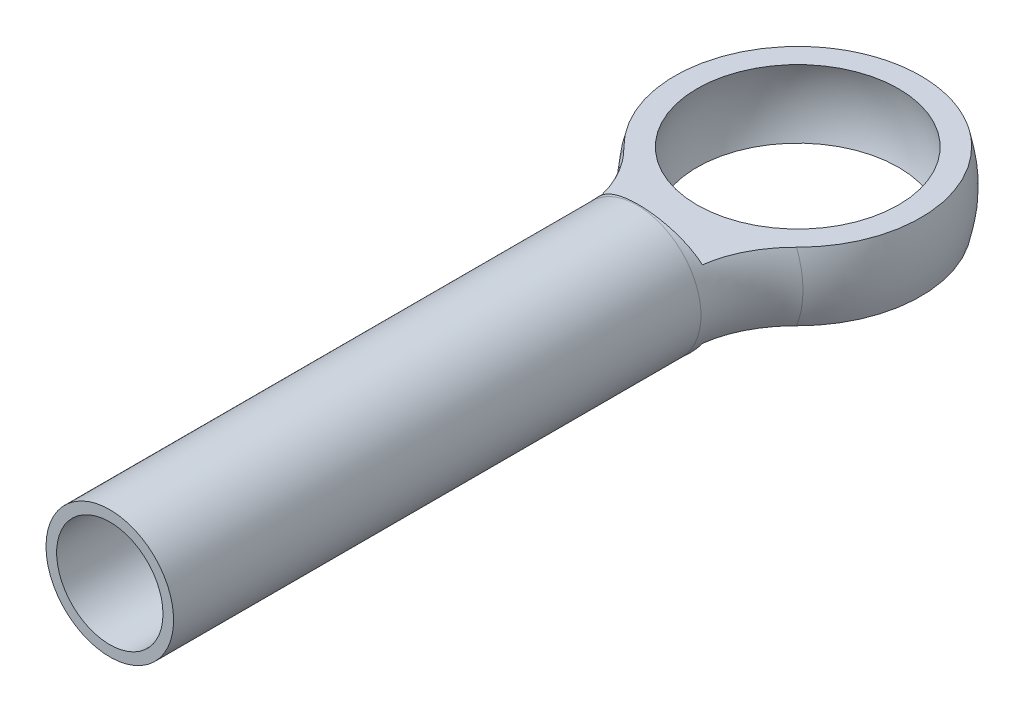
ISO-10303-21;
HEADER;
FILE_DESCRIPTION(('STEP AP214'),'2;1');
FILE_NAME('part.step','',(''),(''),'','','');
FILE_SCHEMA(('AUTOMOTIVE_DESIGN { 1 0 10303 214 1 1 1 1 }'));
ENDSEC;
DATA;
#1=APPLICATION_CONTEXT('core data for automotive mechanical design processes');
#2=APPLICATION_PROTOCOL_DEFINITION('international standard','automotive_design',2000,#1);
#3=PRODUCT_CONTEXT('',#1,'mechanical');
#4=PRODUCT('Part','Part','',(#3));
#5=PRODUCT_RELATED_PRODUCT_CATEGORY('part','',(#4));
#6=PRODUCT_DEFINITION_FORMATION('','',#4);
#7=PRODUCT_DEFINITION_CONTEXT('part definition',#1,'design');
#8=PRODUCT_DEFINITION('design','',#6,#7);
#9=PRODUCT_DEFINITION_SHAPE('','',#8);
#10=(LENGTH_UNIT() NAMED_UNIT(*) SI_UNIT(.MILLI.,.METRE.));
#11=(NAMED_UNIT(*) PLANE_ANGLE_UNIT() SI_UNIT($,.RADIAN.));
#12=(NAMED_UNIT(*) SI_UNIT($,.STERADIAN.) SOLID_ANGLE_UNIT());
#13=UNCERTAINTY_MEASURE_WITH_UNIT(LENGTH_MEASURE(1.E-05),#10,'distance_accuracy_value','');
#14=(GEOMETRIC_REPRESENTATION_CONTEXT(3) GLOBAL_UNCERTAINTY_ASSIGNED_CONTEXT((#13)) GLOBAL_UNIT_ASSIGNED_CONTEXT((#10,
#11,#12)) REPRESENTATION_CONTEXT('',''));
#15=CARTESIAN_POINT('',(0.,0.,0.));
#16=DIRECTION('',(0.,0.,1.));
#17=DIRECTION('',(1.,0.,0.));
#18=AXIS2_PLACEMENT_3D('',#15,#16,#17);
#19=CARTESIAN_POINT('',(0.,0.,4.79414486639693));
#20=DIRECTION('',(0.,0.,-1.));
#21=DIRECTION('',(-1.,0.,0.));
#22=AXIS2_PLACEMENT_3D('',#19,#20,#21);
#23=TOROIDAL_SURFACE('',#22,5.08,3.175);
#24=CARTESIAN_POINT('',(0.,0.,4.79414486639693));
#25=DIRECTION('',(0.,0.,-1.));
#26=DIRECTION('',(-1.,0.,0.));
#27=AXIS2_PLACEMENT_3D('',#24,#25,#26);
#28=CIRCLE('',#27,1.905);
#29=CARTESIAN_POINT('',(-1.905,0.,4.79414486639693));
#30=VERTEX_POINT('',#29);
#31=EDGE_CURVE('E167',#30,#30,#28,.T.);
#32=ORIENTED_EDGE('',*,*,#31,.T.);
#33=EDGE_LOOP('',(#32));
#34=FACE_BOUND('',#33,.T.);
#35=CARTESIAN_POINT('',(0.,0.,2.61498810894378));
#36=DIRECTION('',(0.,0.,-1.));
#37=DIRECTION('',(-1.,0.,0.));
#38=AXIS2_PLACEMENT_3D('',#35,#36,#37);
#39=CIRCLE('',#38,2.77090909090909);
#40=CARTESIAN_POINT('',(-2.57792187431711,-1.016,2.61498810894378));
#41=VERTEX_POINT('',#40);
#42=CARTESIAN_POINT('',(-2.57792187431711,1.016,2.61498810894378));
#43=VERTEX_POINT('',#42);
#44=EDGE_CURVE('E112',#41,#43,#39,.T.);
#45=ORIENTED_EDGE('',*,*,#44,.F.);
#46=CARTESIAN_POINT('',(-2.11639406325257,-1.016,3.17711222518834));
#47=CARTESIAN_POINT('',(-2.01819716090534,-1.016,3.32668512273117));
#48=CARTESIAN_POINT('',(-1.93188686392438,-1.016,3.48417566693142));
#49=CARTESIAN_POINT('',(-1.78741547256896,-1.016,3.81181443928026));
#50=CARTESIAN_POINT('',(-1.72924928215958,-1.016,3.98196036948447));
#51=CARTESIAN_POINT('',(-1.66707849415592,-1.016,4.24143794402896));
#52=CARTESIAN_POINT('',(-1.65057154766357,-1.016,4.3278934820574));
#53=CARTESIAN_POINT('',(-1.62593046187099,-1.016,4.50201596606918));
#54=CARTESIAN_POINT('',(-1.6177960518731,-1.016,4.58968287279413));
#55=CARTESIAN_POINT('',(-1.61016898722803,-1.016,4.76532270648893));
#56=CARTESIAN_POINT('',(-1.61066936125318,-1.016,4.85329532926592));
#57=CARTESIAN_POINT('',(-1.62026287922338,-1.016,5.02874372374261));
#58=CARTESIAN_POINT('',(-1.62935543807155,-1.016,5.11621952886576));
#59=CARTESIAN_POINT('',(-1.66573097291168,-1.016,5.35428529015057));
#60=CARTESIAN_POINT('',(-1.70149811771134,-1.016,5.50364503883666));
#61=CARTESIAN_POINT('',(-1.79568570338797,-1.016,5.79496150703005));
#62=CARTESIAN_POINT('',(-1.85412212587819,-1.016,5.93691292345928));
#63=CARTESIAN_POINT('',(-1.99615149145866,-1.016,6.22199612861055));
#64=CARTESIAN_POINT('',(-2.08138794932638,-1.016,6.3643070437128));
#65=CARTESIAN_POINT('',(-2.271621500792,-1.016,6.63499174081512));
#66=CARTESIAN_POINT('',(-2.3766241082396,-1.016,6.76336161811022));
#67=CARTESIAN_POINT('',(-2.62006966669461,-1.016,7.02122145850842));
#68=CARTESIAN_POINT('',(-2.76114843681511,-1.016,7.14823549674076));
#69=CARTESIAN_POINT('',(-3.06196174697499,-1.016,7.37788491782393));
#70=CARTESIAN_POINT('',(-3.22170200204164,-1.016,7.48051280313634));
#71=CARTESIAN_POINT('',(-3.56229345852077,-1.016,7.66179465288261));
#72=CARTESIAN_POINT('',(-3.7437217643592,-1.016,7.73936948189852));
#73=CARTESIAN_POINT('',(-4.11724555414776,-1.016,7.86209281213687));
#74=CARTESIAN_POINT('',(-4.30933998756276,-1.016,7.90724450071854));
#75=CARTESIAN_POINT('',(-4.6937056137791,-1.016,7.96250288114457));
#76=CARTESIAN_POINT('',(-4.88585680148168,-1.016,7.97344233823646));
#77=CARTESIAN_POINT('',(-5.26914986376476,-1.016,7.96181217042673));
#78=CARTESIAN_POINT('',(-5.46029189497378,-1.016,7.93924790873082));
#79=CARTESIAN_POINT('',(-5.82982838871286,-1.016,7.86212809875772));
#80=CARTESIAN_POINT('',(-6.00843430131685,-1.016,7.80858459658834));
#81=CARTESIAN_POINT('',(-6.35379442307676,-1.016,7.67160809414254));
#82=CARTESIAN_POINT('',(-6.52055016645232,-1.016,7.58817897158223));
#83=CARTESIAN_POINT('',(-6.83366291311807,-1.016,7.39584200339504));
#84=CARTESIAN_POINT('',(-6.98038453429255,-1.016,7.28752741341682));
#85=CARTESIAN_POINT('',(-7.2532430682936,-1.016,7.04749553975603));
#86=CARTESIAN_POINT('',(-7.37938160986425,-1.016,6.91578010951216));
#87=CARTESIAN_POINT('',(-7.60575147823301,-1.016,6.63462024822823));
#88=CARTESIAN_POINT('',(-7.70630702122059,-1.016,6.48543676199083));
#89=CARTESIAN_POINT('',(-7.88072005503297,-1.016,6.17220332199417));
#90=CARTESIAN_POINT('',(-7.95457878655562,-1.016,6.00815405954482));
#91=CARTESIAN_POINT('',(-8.07295352274553,-1.016,5.67119628180054));
#92=CARTESIAN_POINT('',(-8.11768842717549,-1.016,5.49836463713633));
#93=CARTESIAN_POINT('',(-8.1773946573953,-1.016,5.14763525875114));
#94=CARTESIAN_POINT('',(-8.19236670573436,-1.016,4.96973764812234));
#95=CARTESIAN_POINT('',(-8.19210875395223,-1.016,4.61458668442078));
#96=CARTESIAN_POINT('',(-8.17698372829121,-1.016,4.43733324478239));
#97=CARTESIAN_POINT('',(-8.11718427673769,-1.016,4.08788497304409));
#98=CARTESIAN_POINT('',(-8.07251006642738,-1.016,3.91569010404791));
#99=CARTESIAN_POINT('',(-7.95492218770949,-1.016,3.58125485930708));
#100=CARTESIAN_POINT('',(-7.88201188696208,-1.016,3.41901329912399));
#101=CARTESIAN_POINT('',(-7.71007058543719,-1.016,3.10902271643093));
#102=CARTESIAN_POINT('',(-7.61103941175251,-1.016,2.96127378986388));
#103=CARTESIAN_POINT('',(-7.38936271760162,-1.016,2.68393076268308));
#104=CARTESIAN_POINT('',(-7.26664284006675,-1.016,2.55439610860047));
#105=CARTESIAN_POINT('',(-7.00133411304025,-1.016,2.31759694362383));
#106=CARTESIAN_POINT('',(-6.85874481170221,-1.016,2.21033293932016));
#107=CARTESIAN_POINT('',(-6.55668941711582,-1.016,2.02025635009704));
#108=CARTESIAN_POINT('',(-6.39711041360098,-1.016,1.93762325495));
#109=CARTESIAN_POINT('',(-6.06646930327787,-1.016,1.79995712830491));
#110=CARTESIAN_POINT('',(-5.89540660669587,-1.016,1.74492551558136));
#111=CARTESIAN_POINT('',(-5.54439584557427,-1.016,1.66321797169981));
#112=CARTESIAN_POINT('',(-5.36436361647442,-1.016,1.63690396446558));
#113=CARTESIAN_POINT('',(-5.00244593035228,-1.016,1.61425548736475));
#114=CARTESIAN_POINT('',(-4.82056043661046,-1.016,1.6179216126655));
#115=CARTESIAN_POINT('',(-4.45623884446279,-1.016,1.65510126867774));
#116=CARTESIAN_POINT('',(-4.27386304831639,-1.016,1.68920388441238));
#117=CARTESIAN_POINT('',(-3.91706776274594,-1.016,1.78668832965876));
#118=CARTESIAN_POINT('',(-3.74265152205614,-1.016,1.85008199908216));
#119=CARTESIAN_POINT('',(-3.40132540399586,-1.016,2.00626953057743));
#120=CARTESIAN_POINT('',(-3.23478587636191,-1.016,2.09987137837484));
#121=CARTESIAN_POINT('',(-2.91928613340128,-1.016,2.31285323682599));
#122=CARTESIAN_POINT('',(-2.77030969951963,-1.016,2.43220917204158));
#123=CARTESIAN_POINT('',(-2.53463110269688,-1.016,2.65475151185796));
#124=CARTESIAN_POINT('',(-2.4425339133801,-1.016,2.75229728081565));
#125=CARTESIAN_POINT('',(-2.27019519231658,-1.016,2.95744853811672));
#126=CARTESIAN_POINT('',(-2.18995902519773,-1.016,3.06505854271211));
#127=CARTESIAN_POINT('',(-2.11639406325257,-1.016,3.17711222518834));
#128=B_SPLINE_CURVE_WITH_KNOTS('',3,(#46,#47,#48,#49,#50,#51,#52,#53,#54,#55,#56,#57,#58,#59,
#60,#61,#62,#63,#64,#65,#66,#67,#68,#69,#70,#71,#72,#73,#74,#75,#76,#77,#78,#79,#80,#81,#82,#83,
#84,#85,#86,#87,#88,#89,#90,#91,#92,#93,#94,#95,#96,#97,#98,#99,#100,#101,#102,#103,#104,#105,
#106,#107,#108,#109,#110,#111,#112,#113,#114,#115,#116,#117,#118,#119,#120,#121,#122,#123,#124,
#125,#126,#127),.UNSPECIFIED.,.T.,.F.,(4,2,2,2,2,2,2,2,2,2,2,2,2,2,2,2,2,2,2,2,2,2,2,2,2,2,2,2,
2,2,2,2,2,2,2,2,2,2,2,2,4),(0.,0.536343999537515,1.07259084724226,1.33630071052647,
1.6000020473763,1.8634904938573,2.12696099901561,2.58553034832919,3.04442357367085,
3.54017318447067,4.0360612921699,4.60301533500605,5.17014346333962,5.7591775048378,
6.34815363337091,6.92267715069041,7.49710870939335,8.05375642544459,8.61033194154131,
9.15480908727671,9.69924312748838,10.2363887853085,10.7735094768072,11.306544984382,
11.8395675513609,12.3707342674094,12.901897108264,13.4329966179242,13.9640996432873,
14.4968976973591,15.0297078696581,15.5663107886163,16.1029412872721,16.6462594364258,
17.1895883715896,17.7436668721406,18.2979695362672,18.8685344822137,19.43856834568,
19.8401934642387,20.2419996818725),.UNSPECIFIED.);
#129=CARTESIAN_POINT('',(-1.63046276410829,-1.016,4.47470640655411));
#130=VERTEX_POINT('',#129);
#131=EDGE_CURVE('E68',#41,#130,#128,.T.);
#132=ORIENTED_EDGE('',*,*,#131,.T.);
#133=CARTESIAN_POINT('',(1.63059303002376,-1.0158,4.4746589390073));
#134=CARTESIAN_POINT('',(1.56923800908772,-1.10997761427416,4.49704768162368));
#135=CARTESIAN_POINT('',(1.49990545210543,-1.19855405628788,4.52085986024463));
#136=CARTESIAN_POINT('',(1.34705146478776,-1.36284769951929,4.56871993860588));
#137=CARTESIAN_POINT('',(1.26349480703911,-1.43853201780213,4.59276828040769));
#138=CARTESIAN_POINT('',(1.08423155381991,-1.57493432563623,4.63836415046142));
#139=CARTESIAN_POINT('',(0.988517485538385,-1.63564304201396,4.6599101248532));
#140=CARTESIAN_POINT('',(0.787346405842847,-1.73989526423859,4.69807750752544));
#141=CARTESIAN_POINT('',(0.681902006468488,-1.78346061527425,4.71470517627307));
#142=CARTESIAN_POINT('',(0.468642442733942,-1.85013143863261,4.74055225122489));
#143=CARTESIAN_POINT('',(0.361101452760471,-1.87400210481578,4.75004729194872));
#144=CARTESIAN_POINT('',(0.143119398886449,-1.9029525355066,4.7615974842091));
#145=CARTESIAN_POINT('',(0.0326792977956614,-1.90803846096191,4.76365507504738));
#146=CARTESIAN_POINT('',(-0.178416068549314,-1.89951000507599,4.76023383593055));
#147=CARTESIAN_POINT('',(-0.279144423042599,-1.88736559940208,4.75534737058678));
#148=CARTESIAN_POINT('',(-0.476968039995791,-1.8475538101518,4.73959438510807));
#149=CARTESIAN_POINT('',(-0.574063658286327,-1.81988795118792,4.72872845231516));
#150=CARTESIAN_POINT('',(-0.762808592151711,-1.74995476068753,4.7019872207433));
#151=CARTESIAN_POINT('',(-0.854417941320336,-1.70759270633869,4.68607948447045));
#152=CARTESIAN_POINT('',(-1.02961917069441,-1.60970875513819,4.65073095544986));
#153=CARTESIAN_POINT('',(-1.11320428117659,-1.55417588130874,4.63128721885703));
#154=CARTESIAN_POINT('',(-1.27769123286383,-1.42598154320556,4.58876113893418));
#155=CARTESIAN_POINT('',(-1.35771160462488,-1.35224363154041,4.56550919492716));
#156=CARTESIAN_POINT('',(-1.50449998254413,-1.19267148227201,4.51927862142056));
#157=CARTESIAN_POINT('',(-1.57128214281975,-1.10685033371167,4.49629972497333));
#158=CARTESIAN_POINT('',(-1.63059303002375,-1.0158,4.4746589390073));
#159=B_SPLINE_CURVE_WITH_KNOTS('',3,(#133,#134,#135,#136,#137,#138,#139,#140,#141,#142,#143,
#144,#145,#146,#147,#148,#149,#150,#151,#152,#153,#154,#155,#156,#157,#158),.UNSPECIFIED.,.F.,
.F.,(4,2,2,2,2,2,2,2,2,2,2,2,4),(0.,0.343349256308941,0.687561563175485,1.03198648071933,
1.37597107734363,1.70586101910113,2.03564275520045,2.33892207759125,2.64217161523831,
2.94741318992979,3.25291006215691,3.58525654475218,3.91724574730826),.UNSPECIFIED.);
#160=CARTESIAN_POINT('',(1.63046276410827,-1.016,4.47470640655411));
#161=VERTEX_POINT('',#160);
#162=EDGE_CURVE('E11',#161,#130,#159,.T.);
#163=ORIENTED_EDGE('',*,*,#162,.F.);
#164=CARTESIAN_POINT('',(1.6334434587181,-1.016,4.45060308856988));
#165=CARTESIAN_POINT('',(1.65211874276383,-1.016,4.30496301648562));
#166=CARTESIAN_POINT('',(1.68258602505325,-1.016,4.16078862984625));
#167=CARTESIAN_POINT('',(1.76492827740532,-1.016,3.87861908968929));
#168=CARTESIAN_POINT('',(1.81683275746001,-1.016,3.7406327459153));
#169=CARTESIAN_POINT('',(1.9461032096225,-1.016,3.4586154990874));
#170=CARTESIAN_POINT('',(2.02563685510151,-1.016,3.31558062130488));
#171=CARTESIAN_POINT('',(2.20457187213565,-1.016,3.04257604230675));
#172=CARTESIAN_POINT('',(2.30398047843551,-1.016,2.91261112469537));
#173=CARTESIAN_POINT('',(2.53590134555945,-1.016,2.64995463753516));
#174=CARTESIAN_POINT('',(2.67112941516778,-1.016,2.5196499004339));
#175=CARTESIAN_POINT('',(2.96063319141219,-1.016,2.28223306811463));
#176=CARTESIAN_POINT('',(3.11491423822468,-1.016,2.17512749843941));
#177=CARTESIAN_POINT('',(3.44686344854318,-1.016,1.98239505885415));
#178=CARTESIAN_POINT('',(3.62531582920017,-1.016,1.8981121722968));
#179=CARTESIAN_POINT('',(3.99406138699513,-1.016,1.76143705746173));
#180=CARTESIAN_POINT('',(4.1843539936772,-1.016,1.70904329409205));
#181=CARTESIAN_POINT('',(4.56708104920207,-1.016,1.63904499372128));
#182=CARTESIAN_POINT('',(4.75938458688994,-1.016,1.62072653998643));
#183=CARTESIAN_POINT('',(5.14425770978701,-1.016,1.61776041416303));
#184=CARTESIAN_POINT('',(5.33682724493674,-1.016,1.63310709242616));
#185=CARTESIAN_POINT('',(5.71027190759963,-1.016,1.6963940324077));
#186=CARTESIAN_POINT('',(5.89132429501858,-1.016,1.74328964179383));
#187=CARTESIAN_POINT('',(6.24266833254949,-1.016,1.86752348580511));
#188=CARTESIAN_POINT('',(6.4129614128293,-1.016,1.94485766449868));
#189=CARTESIAN_POINT('',(6.7338608776748,-1.016,2.1257781118661));
#190=CARTESIAN_POINT('',(6.88482759864815,-1.016,2.22872561924847));
#191=CARTESIAN_POINT('',(7.16701021515176,-1.016,2.4588431781247));
#192=CARTESIAN_POINT('',(7.29822777457903,-1.016,2.58601118695687));
#193=CARTESIAN_POINT('',(7.53526494579753,-1.016,2.85898002835786));
#194=CARTESIAN_POINT('',(7.64141792231837,-1.016,3.0044914815872));
#195=CARTESIAN_POINT('',(7.82755111503909,-1.016,3.31138894546262));
#196=CARTESIAN_POINT('',(7.90753262230498,-1.016,3.47277417252784));
#197=CARTESIAN_POINT('',(8.03841040425135,-1.016,3.80541476676314));
#198=CARTESIAN_POINT('',(8.08953806569398,-1.016,3.97657912802885));
#199=CARTESIAN_POINT('',(8.16220671196929,-1.016,4.32507669872617));
#200=CARTESIAN_POINT('',(8.18374847510192,-1.016,4.50240974575571));
#201=CARTESIAN_POINT('',(8.19658765028195,-1.016,4.85747530710379));
#202=CARTESIAN_POINT('',(8.18800210004166,-1.016,5.03520360102434));
#203=CARTESIAN_POINT('',(8.14109809159419,-1.016,5.38669068091959));
#204=CARTESIAN_POINT('',(8.10277990405329,-1.016,5.56044950301491));
#205=CARTESIAN_POINT('',(7.99755424112216,-1.016,5.89899043766636));
#206=CARTESIAN_POINT('',(7.93066025604886,-1.016,6.06377674471238));
#207=CARTESIAN_POINT('',(7.7702306561237,-1.016,6.37982168316671));
#208=CARTESIAN_POINT('',(7.67669490697769,-1.016,6.53108024638016));
#209=CARTESIAN_POINT('',(7.46538912740538,-1.016,6.81625667841083));
#210=CARTESIAN_POINT('',(7.3475516944929,-1.016,6.9501245927432));
#211=CARTESIAN_POINT('',(7.09120737406762,-1.016,7.1963322211264));
#212=CARTESIAN_POINT('',(6.95270001517598,-1.016,7.3086714440807));
#213=CARTESIAN_POINT('',(6.65799432839747,-1.016,7.50947489904402));
#214=CARTESIAN_POINT('',(6.50168458936364,-1.016,7.59777556834988));
#215=CARTESIAN_POINT('',(6.17659193804926,-1.016,7.74721960802936));
#216=CARTESIAN_POINT('',(6.00780859177358,-1.016,7.80836203296484));
#217=CARTESIAN_POINT('',(5.66045818647432,-1.016,7.90259502882239));
#218=CARTESIAN_POINT('',(5.48179941249281,-1.016,7.93534724989216));
#219=CARTESIAN_POINT('',(5.12153700638973,-1.016,7.97098344135688));
#220=CARTESIAN_POINT('',(4.93993311805646,-1.016,7.97386479900854));
#221=CARTESIAN_POINT('',(4.57525382695998,-1.016,7.94983225851375));
#222=CARTESIAN_POINT('',(4.39221591985635,-1.016,7.92235178666772));
#223=CARTESIAN_POINT('',(4.03309615841458,-1.016,7.83789951990405));
#224=CARTESIAN_POINT('',(3.857014881447,-1.016,7.78092528264114));
#225=CARTESIAN_POINT('',(3.51152664604153,-1.016,7.63747526679172));
#226=CARTESIAN_POINT('',(3.34244384204342,-1.016,7.55021934553012));
#227=CARTESIAN_POINT('',(3.02068059702774,-1.016,7.34937944053643));
#228=CARTESIAN_POINT('',(2.86800460338782,-1.016,7.23578834436919));
#229=CARTESIAN_POINT('',(2.57859764952111,-1.016,6.98162263682148));
#230=CARTESIAN_POINT('',(2.44250160849366,-1.016,6.84032549667717));
#231=CARTESIAN_POINT('',(2.1959064610247,-1.016,6.53650483537784));
#232=CARTESIAN_POINT('',(2.0854281097191,-1.016,6.37396426860051));
#233=CARTESIAN_POINT('',(1.94326417149822,-1.016,6.11825232395838));
#234=CARTESIAN_POINT('',(1.89992997228025,-1.016,6.03140582825862));
#235=CARTESIAN_POINT('',(1.82150622513299,-1.016,5.85401558990623));
#236=CARTESIAN_POINT('',(1.78641742424004,-1.016,5.76347151312292));
#237=CARTESIAN_POINT('',(1.72535349724883,-1.016,5.57963041908832));
#238=CARTESIAN_POINT('',(1.6993531890987,-1.016,5.48634179758838));
#239=CARTESIAN_POINT('',(1.6570614367969,-1.016,5.29763431392582));
#240=CARTESIAN_POINT('',(1.64076446615567,-1.016,5.20221669651424));
#241=CARTESIAN_POINT('',(1.61693216774331,-1.016,4.99737801271824));
#242=CARTESIAN_POINT('',(1.61085084426905,-1.016,4.88778270235673));
#243=CARTESIAN_POINT('',(1.61214190094999,-1.016,4.66872072999501));
#244=CARTESIAN_POINT('',(1.61951125285985,-1.016,4.55925404458851));
#245=CARTESIAN_POINT('',(1.6334434587181,-1.016,4.45060308856988));
#246=B_SPLINE_CURVE_WITH_KNOTS('',3,(#164,#165,#166,#167,#168,#169,#170,#171,#172,#173,#174,
#175,#176,#177,#178,#179,#180,#181,#182,#183,#184,#185,#186,#187,#188,#189,#190,#191,#192,#193,
#194,#195,#196,#197,#198,#199,#200,#201,#202,#203,#204,#205,#206,#207,#208,#209,#210,#211,#212,
#213,#214,#215,#216,#217,#218,#219,#220,#221,#222,#223,#224,#225,#226,#227,#228,#229,#230,#231,
#232,#233,#234,#235,#236,#237,#238,#239,#240,#241,#242,#243,#244,#245),.UNSPECIFIED.,.T.,.F.,(4,
2,2,2,2,2,2,2,2,2,2,2,2,2,2,2,2,2,2,2,2,2,2,2,2,2,2,2,2,2,2,2,2,2,2,2,2,2,2,2,4),(0.,
0.440160967489117,0.880929881519013,1.37002518398352,1.85929884872763,2.42020884510696,
2.9812764119051,3.57043716606438,4.15956955671308,4.73621355289087,5.31276078466115,
5.8710999371545,6.42936471627165,6.97490082895003,7.52039095361789,8.05815594064856,
8.59589439516823,9.12925696488746,9.66260550346215,10.193884402719,10.7251584656205,
11.256181996627,11.787208204431,12.319727552806,12.8522590471715,13.3883282253032,
13.9244160637181,14.4668083714357,15.0092481206983,15.5619837711625,16.1147652003626,
16.6829986141795,17.2513856719734,17.8372561219893,18.4235995913393,18.7144318561191,
19.0052904602663,19.295336654564,19.585217496024,19.9136619774435,20.2420325229628),.UNSPECIFIED.);
#247=CARTESIAN_POINT('',(2.57792187431711,-1.016,2.61498810894378));
#248=VERTEX_POINT('',#247);
#249=EDGE_CURVE('E94',#161,#248,#246,.T.);
#250=ORIENTED_EDGE('',*,*,#249,.T.);
#251=CARTESIAN_POINT('',(2.57792187431711,1.016,2.61498810894378));
#252=VERTEX_POINT('',#251);
#253=EDGE_CURVE('E176',#252,#248,#39,.T.);
#254=ORIENTED_EDGE('',*,*,#253,.F.);
#255=CARTESIAN_POINT('',(1.6334434587181,1.016,4.45060308856988));
#256=CARTESIAN_POINT('',(1.61473517188976,1.016,4.59662493703502));
#257=CARTESIAN_POINT('',(1.60788658650794,1.016,4.74420398801708));
#258=CARTESIAN_POINT('',(1.61853124564792,1.016,5.03851592003536));
#259=CARTESIAN_POINT('',(1.63603452542275,1.016,5.18524842718997));
#260=CARTESIAN_POINT('',(1.69487671584723,1.016,5.47885683952983));
#261=CARTESIAN_POINT('',(1.73698751147618,1.016,5.62557584100556));
#262=CARTESIAN_POINT('',(1.84277612976893,1.016,5.91102228321539));
#263=CARTESIAN_POINT('',(1.906470243241,1.016,6.04974359457695));
#264=CARTESIAN_POINT('',(2.06056451375602,1.016,6.33148484216093));
#265=CARTESIAN_POINT('',(2.15311940295647,1.016,6.47332412151661));
#266=CARTESIAN_POINT('',(2.35804457275115,1.016,6.74185296944618));
#267=CARTESIAN_POINT('',(2.47042150260329,1.016,6.86853743036477));
#268=CARTESIAN_POINT('',(2.72830999414293,1.016,7.12003351479484));
#269=CARTESIAN_POINT('',(2.87623829223447,1.016,7.24238006486174));
#270=CARTESIAN_POINT('',(3.1901164350222,1.016,7.46128651157526));
#271=CARTESIAN_POINT('',(3.35607034415048,1.016,7.55784057545846));
#272=CARTESIAN_POINT('',(3.7062093929586,1.016,7.72427562241569));
#273=CARTESIAN_POINT('',(3.89075557545575,1.016,7.79340041955381));
#274=CARTESIAN_POINT('',(4.26903404923847,1.016,7.89869797691964));
#275=CARTESIAN_POINT('',(4.46276530952072,1.016,7.93487442635228));
#276=CARTESIAN_POINT('',(4.84816945592605,1.016,7.97209678142193));
#277=CARTESIAN_POINT('',(5.03975093523526,1.016,7.97408718827111));
#278=CARTESIAN_POINT('',(5.42036474668001,1.016,7.94482836720215));
#279=CARTESIAN_POINT('',(5.6093974871475,1.016,7.9135845293714));
#280=CARTESIAN_POINT('',(5.97350977944653,1.016,7.81988129367987));
#281=CARTESIAN_POINT('',(6.14883778804167,1.016,7.75838636261779));
#282=CARTESIAN_POINT('',(6.48634614163052,1.016,7.6062266112933));
#283=CARTESIAN_POINT('',(6.64852808428542,1.016,7.51556534233428));
#284=CARTESIAN_POINT('',(6.95165455789277,1.016,7.30972645943973));
#285=CARTESIAN_POINT('',(7.09296589543644,1.016,7.19508875056972));
#286=CARTESIAN_POINT('',(7.35402862139023,1.016,6.94344408314299));
#287=CARTESIAN_POINT('',(7.47378160604813,1.016,6.80643878218624));
#288=CARTESIAN_POINT('',(7.68679215824207,1.016,6.51582067911425));
#289=CARTESIAN_POINT('',(7.78036184455565,1.016,6.36243656887775));
#290=CARTESIAN_POINT('',(7.94021169954832,1.016,6.04205234485301));
#291=CARTESIAN_POINT('',(8.00649304266461,1.016,5.87505281741652));
#292=CARTESIAN_POINT('',(8.10944081619638,1.016,5.53343850379412));
#293=CARTESIAN_POINT('',(8.1463108219737,1.016,5.35888504047796));
#294=CARTESIAN_POINT('',(8.1901246986081,1.016,5.00606268495141));
#295=CARTESIAN_POINT('',(8.19706921866915,1.016,4.82779387342616));
#296=CARTESIAN_POINT('',(8.18085385704896,1.016,4.47317081450906));
#297=CARTESIAN_POINT('',(8.15778443652153,1.016,4.29681242193789));
#298=CARTESIAN_POINT('',(8.08237231359201,1.016,3.95047183690824));
#299=CARTESIAN_POINT('',(8.03002977740494,1.016,3.78048960825125));
#300=CARTESIAN_POINT('',(7.89757549234057,1.016,3.45165449419475));
#301=CARTESIAN_POINT('',(7.81745514438622,1.016,3.29280507346547));
#302=CARTESIAN_POINT('',(7.63177511258655,1.016,2.99074883776492));
#303=CARTESIAN_POINT('',(7.52621519102578,1.016,2.84754216898267));
#304=CARTESIAN_POINT('',(7.29227189515083,1.016,2.58024603843139));
#305=CARTESIAN_POINT('',(7.16380632976438,1.016,2.45622852916178));
#306=CARTESIAN_POINT('',(6.88801726222967,1.016,2.23132867080448));
#307=CARTESIAN_POINT('',(6.74069328806897,1.016,2.13044690096424));
#308=CARTESIAN_POINT('',(6.43018034758838,1.016,1.95379776199418));
#309=CARTESIAN_POINT('',(6.26687750725286,1.016,1.8782306349872));
#310=CARTESIAN_POINT('',(5.93002080282322,1.016,1.75519114929822));
#311=CARTESIAN_POINT('',(5.75646648041387,1.016,1.70772004775846));
#312=CARTESIAN_POINT('',(5.40158486678892,1.016,1.64146672802142));
#313=CARTESIAN_POINT('',(5.22018493385583,1.016,1.62307410174939));
#314=CARTESIAN_POINT('',(4.85683894937901,1.016,1.6163468656905));
#315=CARTESIAN_POINT('',(4.67489284655988,1.016,1.62801517221601));
#316=CARTESIAN_POINT('',(4.31151260388653,1.016,1.68124336011191));
#317=CARTESIAN_POINT('',(4.13017026935242,1.016,1.7234287541161));
#318=CARTESIAN_POINT('',(3.77680135380389,1.016,1.8367538740317));
#319=CARTESIAN_POINT('',(3.60477521195186,1.016,1.90789496356166));
#320=CARTESIAN_POINT('',(3.2694347708371,1.016,2.07932782315429));
#321=CARTESIAN_POINT('',(3.10653146446541,1.016,2.18042328506598));
#322=CARTESIAN_POINT('',(2.79927338380983,1.016,2.40786695213599));
#323=CARTESIAN_POINT('',(2.65493188141935,1.016,2.53423306294259));
#324=CARTESIAN_POINT('',(2.38501672364016,1.016,2.81271568266389));
#325=CARTESIAN_POINT('',(2.26008886828144,1.016,2.96545907895733));
#326=CARTESIAN_POINT('',(2.03861792247024,1.016,3.29025445274354));
#327=CARTESIAN_POINT('',(1.94204175419571,1.016,3.46228360304105));
#328=CARTESIAN_POINT('',(1.80534585631923,1.016,3.77037122892366));
#329=CARTESIAN_POINT('',(1.75698277055952,1.016,3.90280103053626));
#330=CARTESIAN_POINT('',(1.67997231829425,1.016,4.17321932250823));
#331=CARTESIAN_POINT('',(1.6513035459225,1.016,4.31120160455023));
#332=CARTESIAN_POINT('',(1.6334434587181,1.016,4.45060308856988));
#333=B_SPLINE_CURVE_WITH_KNOTS('',3,(#255,#256,#257,#258,#259,#260,#261,#262,#263,#264,#265,
#266,#267,#268,#269,#270,#271,#272,#273,#274,#275,#276,#277,#278,#279,#280,#281,#282,#283,#284,
#285,#286,#287,#288,#289,#290,#291,#292,#293,#294,#295,#296,#297,#298,#299,#300,#301,#302,#303,
#304,#305,#306,#307,#308,#309,#310,#311,#312,#313,#314,#315,#316,#317,#318,#319,#320,#321,#322,
#323,#324,#325,#326,#327,#328,#329,#330,#331,#332),.UNSPECIFIED.,.T.,.F.,(4,2,2,2,2,2,2,2,2,2,2,
2,2,2,2,2,2,2,2,2,2,2,2,2,2,2,2,2,2,2,2,2,2,2,2,2,2,2,4),(0.,0.441190849466691,
0.882563564816214,1.33858663942321,1.79495468386489,2.30108547176175,2.80738636407063,
3.38066946536624,3.95408210048609,4.54235668933048,5.13056540135352,5.70249594936294,
6.2743337531052,6.82901848708801,7.38363570801175,7.92689860751675,8.47012126558058,
9.00656201944509,9.54297968352915,10.0756514223452,10.6083116053141,11.1393700789274,
11.6704255371799,12.2016455393617,12.7328705056246,13.2660414723456,13.7992257865635,
14.3365332111662,14.8738646754967,15.4183360572696,15.9628602620347,16.5188738395664,
17.0749136046291,17.6474826870438,18.2204589129075,18.8096305444183,19.3981120342965,
19.8197591137562,20.2409471742965),.UNSPECIFIED.);
#334=CARTESIAN_POINT('',(1.63046276410826,1.016,4.47470640655412));
#335=VERTEX_POINT('',#334);
#336=EDGE_CURVE('E76',#252,#335,#333,.T.);
#337=ORIENTED_EDGE('',*,*,#336,.T.);
#338=CARTESIAN_POINT('',(1.63059303002376,1.0158,4.4746589390073));
#339=CARTESIAN_POINT('',(1.56923800908772,1.10997761427416,4.49704768162368));
#340=CARTESIAN_POINT('',(1.49990545210543,1.19855405628788,4.52085986024463));
#341=CARTESIAN_POINT('',(1.34705146478776,1.36284769951929,4.56871993860588));
#342=CARTESIAN_POINT('',(1.26349480703911,1.43853201780213,4.59276828040769));
#343=CARTESIAN_POINT('',(1.08423155381991,1.57493432563623,4.63836415046142));
#344=CARTESIAN_POINT('',(0.988517485538385,1.63564304201396,4.6599101248532));
#345=CARTESIAN_POINT('',(0.787346405842847,1.73989526423859,4.69807750752544));
#346=CARTESIAN_POINT('',(0.681902006468488,1.78346061527425,4.71470517627307));
#347=CARTESIAN_POINT('',(0.468642442733942,1.85013143863261,4.74055225122489));
#348=CARTESIAN_POINT('',(0.361101452760471,1.87400210481578,4.75004729194872));
#349=CARTESIAN_POINT('',(0.143119398886449,1.9029525355066,4.7615974842091));
#350=CARTESIAN_POINT('',(0.0326792977956614,1.90803846096191,4.76365507504738));
#351=CARTESIAN_POINT('',(-0.178416068549314,1.89951000507599,4.76023383593055));
#352=CARTESIAN_POINT('',(-0.279144423042599,1.88736559940208,4.75534737058678));
#353=CARTESIAN_POINT('',(-0.476968039995791,1.8475538101518,4.73959438510807));
#354=CARTESIAN_POINT('',(-0.574063658286327,1.81988795118792,4.72872845231516));
#355=CARTESIAN_POINT('',(-0.762808592151711,1.74995476068753,4.7019872207433));
#356=CARTESIAN_POINT('',(-0.854417941320336,1.70759270633869,4.68607948447045));
#357=CARTESIAN_POINT('',(-1.02961917069441,1.60970875513819,4.65073095544986));
#358=CARTESIAN_POINT('',(-1.11320428117659,1.55417588130874,4.63128721885703));
#359=CARTESIAN_POINT('',(-1.27769123286383,1.42598154320556,4.58876113893418));
#360=CARTESIAN_POINT('',(-1.35771160462488,1.35224363154041,4.56550919492716));
#361=CARTESIAN_POINT('',(-1.50449998254413,1.19267148227201,4.51927862142056));
#362=CARTESIAN_POINT('',(-1.57128214281975,1.10685033371167,4.49629972497333));
#363=CARTESIAN_POINT('',(-1.63059303002375,1.0158,4.4746589390073));
#364=B_SPLINE_CURVE_WITH_KNOTS('',3,(#338,#339,#340,#341,#342,#343,#344,#345,#346,#347,#348,
#349,#350,#351,#352,#353,#354,#355,#356,#357,#358,#359,#360,#361,#362,#363),.UNSPECIFIED.,.F.,
.F.,(4,2,2,2,2,2,2,2,2,2,2,2,4),(0.,0.343349256308941,0.687561563175485,1.03198648071933,
1.37597107734363,1.70586101910113,2.03564275520045,2.33892207759125,2.64217161523831,
2.94741318992979,3.25291006215691,3.58525654475218,3.91724574730826),.UNSPECIFIED.);
#365=CARTESIAN_POINT('',(-1.63046276410832,1.016,4.4747064065541));
#366=VERTEX_POINT('',#365);
#367=EDGE_CURVE('E61',#335,#366,#364,.T.);
#368=ORIENTED_EDGE('',*,*,#367,.T.);
#369=CARTESIAN_POINT('',(-2.11639406325257,1.016,3.17711222518834));
#370=CARTESIAN_POINT('',(-2.2225560433847,1.016,3.01539508252378));
#371=CARTESIAN_POINT('',(-2.34280762308346,1.016,2.86268723036799));
#372=CARTESIAN_POINT('',(-2.60710922651663,1.016,2.57906512704246));
#373=CARTESIAN_POINT('',(-2.75121351620146,1.016,2.44820196931373));
#374=CARTESIAN_POINT('',(-3.05976437649352,1.016,2.21153998623437));
#375=CARTESIAN_POINT('',(-3.22429596093048,1.016,2.10585164033175));
#376=CARTESIAN_POINT('',(-3.56867422278369,1.016,1.92366807151352));
#377=CARTESIAN_POINT('',(-3.74851032885608,1.016,1.84715289472663));
#378=CARTESIAN_POINT('',(-4.11867304639671,1.016,1.72592521245021));
#379=CARTESIAN_POINT('',(-4.30900162845376,1.016,1.6812187030125));
#380=CARTESIAN_POINT('',(-4.69457319816501,1.016,1.62553867440883));
#381=CARTESIAN_POINT('',(-4.88981626431515,1.016,1.61456569439232));
#382=CARTESIAN_POINT('',(-5.27295902031854,1.016,1.62699656450835));
#383=CARTESIAN_POINT('',(-5.46089405384055,1.016,1.64931345601303));
#384=CARTESIAN_POINT('',(-5.83008449721643,1.016,1.72607107667093));
#385=CARTESIAN_POINT('',(-6.0113410993122,1.016,1.78050604225477));
#386=CARTESIAN_POINT('',(-6.35691667262787,1.016,1.91827333158966));
#387=CARTESIAN_POINT('',(-6.52155827713838,1.016,2.00079697618073));
#388=CARTESIAN_POINT('',(-6.83431081163157,1.016,2.19277914194183));
#389=CARTESIAN_POINT('',(-6.98242339890276,1.016,2.30223495921356));
#390=CARTESIAN_POINT('',(-7.25525523095544,1.016,2.54288718560234));
#391=CARTESIAN_POINT('',(-7.38033304324264,1.016,2.67367724775043));
#392=CARTESIAN_POINT('',(-7.60647940681555,1.016,2.95458769975763));
#393=CARTESIAN_POINT('',(-7.70754940090126,1.016,3.10470692715363));
#394=CARTESIAN_POINT('',(-7.88176557448934,1.016,3.41834437441003));
#395=CARTESIAN_POINT('',(-7.95518643650896,1.016,3.5817100674505));
#396=CARTESIAN_POINT('',(-8.07339021216124,1.016,3.91849258253129));
#397=CARTESIAN_POINT('',(-8.11817412654358,1.016,4.09190905310511));
#398=CARTESIAN_POINT('',(-8.17762162740683,1.016,4.44286498480204));
#399=CARTESIAN_POINT('',(-8.19244628209003,1.016,4.62037718070768));
#400=CARTESIAN_POINT('',(-8.19202598924664,1.016,4.97536472407117));
#401=CARTESIAN_POINT('',(-8.17678149610585,1.016,5.15284007204531));
#402=CARTESIAN_POINT('',(-8.11672275049844,1.016,5.50239276365778));
#403=CARTESIAN_POINT('',(-8.07196019125879,1.016,5.67447899407123));
#404=CARTESIAN_POINT('',(-7.95422123740955,1.016,6.00870966358804));
#405=CARTESIAN_POINT('',(-7.88124485142347,1.016,6.17085410573009));
#406=CARTESIAN_POINT('',(-7.70906657416051,1.016,6.48088017434316));
#407=CARTESIAN_POINT('',(-7.6098253207867,1.016,6.62873993511325));
#408=CARTESIAN_POINT('',(-7.38804295895276,1.016,6.90580242360064));
#409=CARTESIAN_POINT('',(-7.2655015056367,1.016,7.03500487512957));
#410=CARTESIAN_POINT('',(-6.99996865360739,1.016,7.27181784115408));
#411=CARTESIAN_POINT('',(-6.85687727972285,1.016,7.37931622627486));
#412=CARTESIAN_POINT('',(-6.55481978392811,1.016,7.56902269911826));
#413=CARTESIAN_POINT('',(-6.39585314051768,1.016,7.65122995566886));
#414=CARTESIAN_POINT('',(-6.06495778500309,1.016,7.78892141337567));
#415=CARTESIAN_POINT('',(-5.89291961792893,1.016,7.84414244031665));
#416=CARTESIAN_POINT('',(-5.54209659454725,1.016,7.92540366192685));
#417=CARTESIAN_POINT('',(-5.36331138740573,1.016,7.95144233699897));
#418=CARTESIAN_POINT('',(-5.00104425251146,1.016,7.97413137747003));
#419=CARTESIAN_POINT('',(-4.81753281869281,1.016,7.97030871201404));
#420=CARTESIAN_POINT('',(-4.45362226796576,1.016,7.93266543108064));
#421=CARTESIAN_POINT('',(-4.27322354333558,1.016,7.89884106239312));
#422=CARTESIAN_POINT('',(-3.91593212673765,1.016,7.80136240410317));
#423=CARTESIAN_POINT('',(-3.73923324151681,1.016,7.73699844156085));
#424=CARTESIAN_POINT('',(-3.39866459288148,1.016,7.58043592941345));
#425=CARTESIAN_POINT('',(-3.23479552199985,1.016,7.48823587856353));
#426=CARTESIAN_POINT('',(-2.91901934640647,1.016,7.27544839554522));
#427=CARTESIAN_POINT('',(-2.76765458297265,1.016,7.15405527192905));
#428=CARTESIAN_POINT('',(-2.48686008799912,1.016,6.88793044216053));
#429=CARTESIAN_POINT('',(-2.35744975124368,1.016,6.74317831837415));
#430=CARTESIAN_POINT('',(-2.12283726064158,1.016,6.43122578471382));
#431=CARTESIAN_POINT('',(-2.01806394096418,1.016,6.26369801568932));
#432=CARTESIAN_POINT('',(-1.8852521781965,1.016,6.00040568708136));
#433=CARTESIAN_POINT('',(-1.84503709916084,1.016,5.91063283063346));
#434=CARTESIAN_POINT('',(-1.77345908774118,1.016,5.7276461695944));
#435=CARTESIAN_POINT('',(-1.74209017732869,1.016,5.63443473711099));
#436=CARTESIAN_POINT('',(-1.69116579608245,1.016,5.45310143549434));
#437=CARTESIAN_POINT('',(-1.67085007183294,1.016,5.36519278116664));
#438=CARTESIAN_POINT('',(-1.63886691088183,1.016,5.18785600099512));
#439=CARTESIAN_POINT('',(-1.62719427744896,1.016,5.09842882132163));
#440=CARTESIAN_POINT('',(-1.61284567526905,1.016,4.91890247111959));
#441=CARTESIAN_POINT('',(-1.61016465605374,1.016,4.82880370632551));
#442=CARTESIAN_POINT('',(-1.61387445144712,1.016,4.64880123705969));
#443=CARTESIAN_POINT('',(-1.62026429418464,1.016,4.5588975127245));
#444=CARTESIAN_POINT('',(-1.64033619492083,1.016,4.39311806843522));
#445=CARTESIAN_POINT('',(-1.65282857948942,1.016,4.31709582553143));
#446=CARTESIAN_POINT('',(-1.68401516764523,1.016,4.16632633308211));
#447=CARTESIAN_POINT('',(-1.70271180667512,1.016,4.09157959636287));
#448=CARTESIAN_POINT('',(-1.76757359530784,1.016,3.87004911503686));
#449=CARTESIAN_POINT('',(-1.82254145362918,1.016,3.72573373959509));
#450=CARTESIAN_POINT('',(-1.92074985787161,1.016,3.51546618553789));
#451=CARTESIAN_POINT('',(-1.9564857487305,1.016,3.4458459595364));
#452=CARTESIAN_POINT('',(-2.03284557535424,1.016,3.309364124798));
#453=CARTESIAN_POINT('',(-2.07346803249883,1.016,3.24250168976678));
#454=CARTESIAN_POINT('',(-2.11639406325257,1.016,3.17711222518834));
#455=B_SPLINE_CURVE_WITH_KNOTS('',3,(#369,#370,#371,#372,#373,#374,#375,#376,#377,#378,#379,
#380,#381,#382,#383,#384,#385,#386,#387,#388,#389,#390,#391,#392,#393,#394,#395,#396,#397,#398,
#399,#400,#401,#402,#403,#404,#405,#406,#407,#408,#409,#410,#411,#412,#413,#414,#415,#416,#417,
#418,#419,#420,#421,#422,#423,#424,#425,#426,#427,#428,#429,#430,#431,#432,#433,#434,#435,#436,
#437,#438,#439,#440,#441,#442,#443,#444,#445,#446,#447,#448,#449,#450,#451,#452,#453,#454),
.UNSPECIFIED.,.T.,.F.,(4,2,2,2,2,2,2,2,2,2,2,2,2,2,2,2,2,2,2,2,2,2,2,2,2,2,2,2,2,2,2,2,2,2,2,2,
2,2,2,2,2,2,4),(0.,0.580053004122513,1.16144426411626,1.74534179208794,2.32883922615694,
2.91244662253725,3.49606334643156,4.06103663288598,4.62590856604015,5.17572837414324,
5.72549300471926,6.26580109348655,6.80607670309038,7.34083366845915,7.8755719451353,
8.40742760898819,8.93927523583908,9.4701939343881,10.0011124706629,10.5328312235307,
11.0645578467448,11.5989649310102,12.1333895762465,12.6729268830247,13.2124922835368,
13.7606220220013,14.3088203411147,14.8704328427435,15.4320756384465,16.0114842106036,
16.5914020030513,17.1807695536225,17.4755064763161,17.7700437429497,18.040319411569,
18.3104324424115,18.5803937289797,18.8503260935118,19.0811786121286,19.3121218579186,
19.7732865373864,20.007898690819,20.2424400309746),.UNSPECIFIED.);
#456=EDGE_CURVE('E148',#366,#43,#455,.T.);
#457=ORIENTED_EDGE('',*,*,#456,.T.);
#458=EDGE_LOOP('',(#45,#132,#163,#250,#254,#337,#368,#457));
#459=FACE_BOUND('',#458,.T.);
#460=ADVANCED_FACE('F47',(#34,#459),#23,.F.);
#461=CARTESIAN_POINT('',(0.,0.,0.));
#462=DIRECTION('',(0.,0.,-1.));
#463=DIRECTION('',(1.,0.,0.));
#464=AXIS2_PLACEMENT_3D('',#461,#462,#463);
#465=SPHERICAL_SURFACE('',#464,3.81);
#466=ORIENTED_EDGE('',*,*,#253,.T.);
#467=CARTESIAN_POINT('',(0.,-1.016,0.));
#468=DIRECTION('',(0.,-1.,0.));
#469=DIRECTION('',(0.,0.,-1.));
#470=AXIS2_PLACEMENT_3D('',#467,#468,#469);
#471=CIRCLE('',#470,3.67203540287944);
#472=EDGE_CURVE('E98',#248,#41,#471,.F.);
#473=ORIENTED_EDGE('',*,*,#472,.T.);
#474=ORIENTED_EDGE('',*,*,#44,.T.);
#475=CARTESIAN_POINT('',(0.,1.016,0.));
#476=DIRECTION('',(0.,1.,0.));
#477=DIRECTION('',(0.,0.,1.));
#478=AXIS2_PLACEMENT_3D('',#475,#476,#477);
#479=CIRCLE('',#478,3.67203540287944);
#480=EDGE_CURVE('E188',#43,#252,#479,.F.);
#481=ORIENTED_EDGE('',*,*,#480,.T.);
#482=EDGE_LOOP('',(#466,#473,#474,#481));
#483=FACE_BOUND('',#482,.T.);
#484=ADVANCED_FACE('F201',(#483),#465,.T.);
#485=CARTESIAN_POINT('',(0.,0.,0.));
#486=DIRECTION('',(0.,1.,0.));
#487=DIRECTION('',(0.,0.,-1.));
#488=AXIS2_PLACEMENT_3D('',#485,#486,#487);
#489=SPHERICAL_SURFACE('',#488,3.175);
#490=CARTESIAN_POINT('',(0.,1.016,0.));
#491=DIRECTION('',(0.,1.,0.));
#492=DIRECTION('',(0.,0.,1.));
#493=AXIS2_PLACEMENT_3D('',#490,#491,#492);
#494=CIRCLE('',#493,3.00805069771106);
#495=CARTESIAN_POINT('',(0.,1.016,3.00805069771106));
#496=VERTEX_POINT('',#495);
#497=EDGE_CURVE('E117',#496,#496,#494,.T.);
#498=ORIENTED_EDGE('',*,*,#497,.T.);
#499=EDGE_LOOP('',(#498));
#500=FACE_BOUND('',#499,.T.);
#501=CARTESIAN_POINT('',(0.,0.,3.01056316933533));
#502=DIRECTION('',(0.,0.,1.));
#503=DIRECTION('',(1.,0.,0.));
#504=AXIS2_PLACEMENT_3D('',#501,#502,#503);
#505=CIRCLE('',#504,1.00853081432428);
#506=CARTESIAN_POINT('',(1.00853081432429,0.,3.01056316933533));
#507=VERTEX_POINT('',#506);
#508=EDGE_CURVE('E168',#507,#507,#505,.T.);
#509=ORIENTED_EDGE('',*,*,#508,.T.);
#510=EDGE_LOOP('',(#509));
#511=FACE_BOUND('',#510,.T.);
#512=CARTESIAN_POINT('',(0.,-1.016,0.));
#513=DIRECTION('',(0.,-1.,0.));
#514=DIRECTION('',(0.,0.,-1.));
#515=AXIS2_PLACEMENT_3D('',#512,#513,#514);
#516=CIRCLE('',#515,3.00805069771106);
#517=CARTESIAN_POINT('',(0.,-1.016,-3.00805069771106));
#518=VERTEX_POINT('',#517);
#519=EDGE_CURVE('E108',#518,#518,#516,.T.);
#520=ORIENTED_EDGE('',*,*,#519,.T.);
#521=EDGE_LOOP('',(#520));
#522=FACE_BOUND('',#521,.T.);
#523=ADVANCED_FACE('F210',(#500,#511,#522),#489,.F.);
#524=CARTESIAN_POINT('',(-1.905,0.,20.5421448663969));
#525=DIRECTION('',(0.,0.,1.));
#526=DIRECTION('',(1.,0.,0.));
#527=AXIS2_PLACEMENT_3D('',#524,#525,#526);
#528=PLANE('',#527);
#529=CARTESIAN_POINT('',(0.,0.,20.5421448663969));
#530=DIRECTION('',(0.,0.,1.));
#531=DIRECTION('',(1.,0.,0.));
#532=AXIS2_PLACEMENT_3D('',#529,#530,#531);
#533=CIRCLE('',#532,1.5875);
#534=CARTESIAN_POINT('',(1.5875,0.,20.5421448663969));
#535=VERTEX_POINT('',#534);
#536=EDGE_CURVE('E154',#535,#535,#533,.T.);
#537=ORIENTED_EDGE('',*,*,#536,.F.);
#538=EDGE_LOOP('',(#537));
#539=FACE_BOUND('',#538,.T.);
#540=CARTESIAN_POINT('',(0.,0.,20.5421448663969));
#541=DIRECTION('',(0.,0.,-1.));
#542=DIRECTION('',(-1.,0.,0.));
#543=AXIS2_PLACEMENT_3D('',#540,#541,#542);
#544=CIRCLE('',#543,1.905);
#545=CARTESIAN_POINT('',(-1.905,0.,20.5421448663969));
#546=VERTEX_POINT('',#545);
#547=EDGE_CURVE('E172',#546,#546,#544,.T.);
#548=ORIENTED_EDGE('',*,*,#547,.F.);
#549=EDGE_LOOP('',(#548));
#550=FACE_BOUND('',#549,.T.);
#551=ADVANCED_FACE('F213',(#539,#550),#528,.T.);
#552=CARTESIAN_POINT('',(0.,0.,-3.81));
#553=DIRECTION('',(0.,0.,-1.));
#554=DIRECTION('',(-1.,0.,0.));
#555=AXIS2_PLACEMENT_3D('',#552,#553,#554);
#556=CYLINDRICAL_SURFACE('',#555,1.905);
#557=ORIENTED_EDGE('',*,*,#547,.T.);
#558=EDGE_LOOP('',(#557));
#559=FACE_BOUND('',#558,.T.);
#560=ORIENTED_EDGE('',*,*,#31,.F.);
#561=EDGE_LOOP('',(#560));
#562=FACE_BOUND('',#561,.T.);
#563=ADVANCED_FACE('F240',(#559,#562),#556,.T.);
#564=CARTESIAN_POINT('',(0.,0.,14.1921448663969));
#565=DIRECTION('',(0.,0.,1.));
#566=DIRECTION('',(1.,0.,0.));
#567=AXIS2_PLACEMENT_3D('',#564,#565,#566);
#568=PLANE('',#567);
#569=CARTESIAN_POINT('',(0.,0.,14.1921448663969));
#570=DIRECTION('',(0.,0.,1.));
#571=DIRECTION('',(1.,0.,0.));
#572=AXIS2_PLACEMENT_3D('',#569,#570,#571);
#573=CIRCLE('',#572,1.5875);
#574=CARTESIAN_POINT('',(1.5875,0.,14.1921448663969));
#575=VERTEX_POINT('',#574);
#576=EDGE_CURVE('E155',#575,#575,#573,.T.);
#577=ORIENTED_EDGE('',*,*,#576,.T.);
#578=EDGE_LOOP('',(#577));
#579=FACE_BOUND('',#578,.T.);
#580=CARTESIAN_POINT('',(0.,0.,14.1921448663969));
#581=DIRECTION('',(0.,0.,1.));
#582=DIRECTION('',(1.,0.,0.));
#583=AXIS2_PLACEMENT_3D('',#580,#581,#582);
#584=CIRCLE('',#583,0.635);
#585=CARTESIAN_POINT('',(0.635000000000003,0.,14.1921448663969));
#586=VERTEX_POINT('',#585);
#587=EDGE_CURVE('E159',#586,#586,#584,.F.);
#588=ORIENTED_EDGE('',*,*,#587,.T.);
#589=EDGE_LOOP('',(#588));
#590=FACE_BOUND('',#589,.T.);
#591=ADVANCED_FACE('F229',(#579,#590),#568,.T.);
#592=CARTESIAN_POINT('',(0.,0.,14.1921448663969));
#593=DIRECTION('',(0.,0.,1.));
#594=DIRECTION('',(1.,0.,0.));
#595=AXIS2_PLACEMENT_3D('',#592,#593,#594);
#596=CYLINDRICAL_SURFACE('',#595,1.5875);
#597=ORIENTED_EDGE('',*,*,#576,.F.);
#598=EDGE_LOOP('',(#597));
#599=FACE_BOUND('',#598,.T.);
#600=ORIENTED_EDGE('',*,*,#536,.T.);
#601=EDGE_LOOP('',(#600));
#602=FACE_BOUND('',#601,.T.);
#603=ADVANCED_FACE('F220',(#599,#602),#596,.F.);
#604=CARTESIAN_POINT('',(0.,0.,4.79414486639693));
#605=DIRECTION('',(0.,0.,-1.));
#606=DIRECTION('',(-1.,0.,0.));
#607=AXIS2_PLACEMENT_3D('',#604,#605,#606);
#608=TOROIDAL_SURFACE('',#607,5.08,4.445);
#609=CARTESIAN_POINT('',(0.,0.,4.79414486639693));
#610=DIRECTION('',(0.,0.,-1.));
#611=DIRECTION('',(-1.,0.,0.));
#612=AXIS2_PLACEMENT_3D('',#609,#610,#611);
#613=CIRCLE('',#612,0.634999999999999);
#614=CARTESIAN_POINT('',(-0.634999999999998,0.,4.79414486639693));
#615=VERTEX_POINT('',#614);
#616=EDGE_CURVE('E163',#615,#615,#613,.T.);
#617=ORIENTED_EDGE('',*,*,#616,.F.);
#618=EDGE_LOOP('',(#617));
#619=FACE_BOUND('',#618,.T.);
#620=ORIENTED_EDGE('',*,*,#508,.F.);
#621=EDGE_LOOP('',(#620));
#622=FACE_BOUND('',#621,.T.);
#623=ADVANCED_FACE('F217',(#619,#622),#608,.T.);
#624=CARTESIAN_POINT('',(0.,0.,-3.81));
#625=DIRECTION('',(0.,0.,-1.));
#626=DIRECTION('',(-1.,0.,0.));
#627=AXIS2_PLACEMENT_3D('',#624,#625,#626);
#628=CYLINDRICAL_SURFACE('',#627,0.635);
#629=ORIENTED_EDGE('',*,*,#616,.T.);
#630=EDGE_LOOP('',(#629));
#631=FACE_BOUND('',#630,.T.);
#632=ORIENTED_EDGE('',*,*,#587,.F.);
#633=EDGE_LOOP('',(#632));
#634=FACE_BOUND('',#633,.T.);
#635=ADVANCED_FACE('F219',(#631,#634),#628,.F.);
#636=CARTESIAN_POINT('',(0.,4.826,0.));
#637=DIRECTION('',(0.,-1.,0.));
#638=DIRECTION('',(0.,0.,-1.));
#639=AXIS2_PLACEMENT_3D('',#636,#637,#638);
#640=CYLINDRICAL_SURFACE('',#639,4.7625);
#641=CARTESIAN_POINT('',(0.,1.016,0.));
#642=DIRECTION('',(0.,1.,0.));
#643=DIRECTION('',(0.,0.,1.));
#644=AXIS2_PLACEMENT_3D('',#641,#642,#643);
#645=CIRCLE('',#644,4.7625);
#646=EDGE_CURVE('E114',#366,#335,#645,.T.);
#647=ORIENTED_EDGE('',*,*,#646,.F.);
#648=ORIENTED_EDGE('',*,*,#367,.F.);
#649=EDGE_LOOP('',(#647,#648));
#650=FACE_BOUND('',#649,.T.);
#651=ADVANCED_FACE('F139',(#650),#640,.F.);
#652=CARTESIAN_POINT('',(0.,1.016,0.));
#653=DIRECTION('',(0.,1.,0.));
#654=DIRECTION('',(0.,0.,1.));
#655=AXIS2_PLACEMENT_3D('',#652,#653,#654);
#656=PLANE('',#655);
#657=ORIENTED_EDGE('',*,*,#646,.T.);
#658=ORIENTED_EDGE('',*,*,#336,.F.);
#659=ORIENTED_EDGE('',*,*,#480,.F.);
#660=ORIENTED_EDGE('',*,*,#456,.F.);
#661=EDGE_LOOP('',(#657,#658,#659,#660));
#662=FACE_BOUND('',#661,.T.);
#663=ORIENTED_EDGE('',*,*,#497,.F.);
#664=EDGE_LOOP('',(#663));
#665=FACE_BOUND('',#664,.T.);
#666=ADVANCED_FACE('F135',(#662,#665),#656,.T.);
#667=CARTESIAN_POINT('',(0.,-4.826,0.));
#668=DIRECTION('',(0.,1.,0.));
#669=DIRECTION('',(0.,0.,1.));
#670=AXIS2_PLACEMENT_3D('',#667,#668,#669);
#671=CYLINDRICAL_SURFACE('',#670,4.7625);
#672=ORIENTED_EDGE('',*,*,#162,.T.);
#673=CARTESIAN_POINT('',(0.,-1.016,0.));
#674=DIRECTION('',(0.,1.,0.));
#675=DIRECTION('',(0.,0.,1.));
#676=AXIS2_PLACEMENT_3D('',#673,#674,#675);
#677=CIRCLE('',#676,4.7625);
#678=EDGE_CURVE('E97',#130,#161,#677,.T.);
#679=ORIENTED_EDGE('',*,*,#678,.T.);
#680=EDGE_LOOP('',(#672,#679));
#681=FACE_BOUND('',#680,.T.);
#682=ADVANCED_FACE('F106',(#681),#671,.F.);
#683=CARTESIAN_POINT('',(0.,-1.016,0.));
#684=DIRECTION('',(0.,-1.,0.));
#685=DIRECTION('',(0.,0.,1.));
#686=AXIS2_PLACEMENT_3D('',#683,#684,#685);
#687=PLANE('',#686);
#688=ORIENTED_EDGE('',*,*,#519,.F.);
#689=EDGE_LOOP('',(#688));
#690=FACE_BOUND('',#689,.T.);
#691=ORIENTED_EDGE('',*,*,#472,.F.);
#692=ORIENTED_EDGE('',*,*,#249,.F.);
#693=ORIENTED_EDGE('',*,*,#678,.F.);
#694=ORIENTED_EDGE('',*,*,#131,.F.);
#695=EDGE_LOOP('',(#691,#692,#693,#694));
#696=FACE_BOUND('',#695,.T.);
#697=ADVANCED_FACE('F96',(#690,#696),#687,.T.);
#698=CLOSED_SHELL('',(#460,#484,#523,#551,#563,#591,#603,#623,#635,#651,#666,#682,#697));
#699=MANIFOLD_SOLID_BREP('B2',#698);
#700=ADVANCED_BREP_SHAPE_REPRESENTATION('',(#18,#699),#14);
#701=SHAPE_DEFINITION_REPRESENTATION(#9,#700);
ENDSEC;
END-ISO-10303-21;
